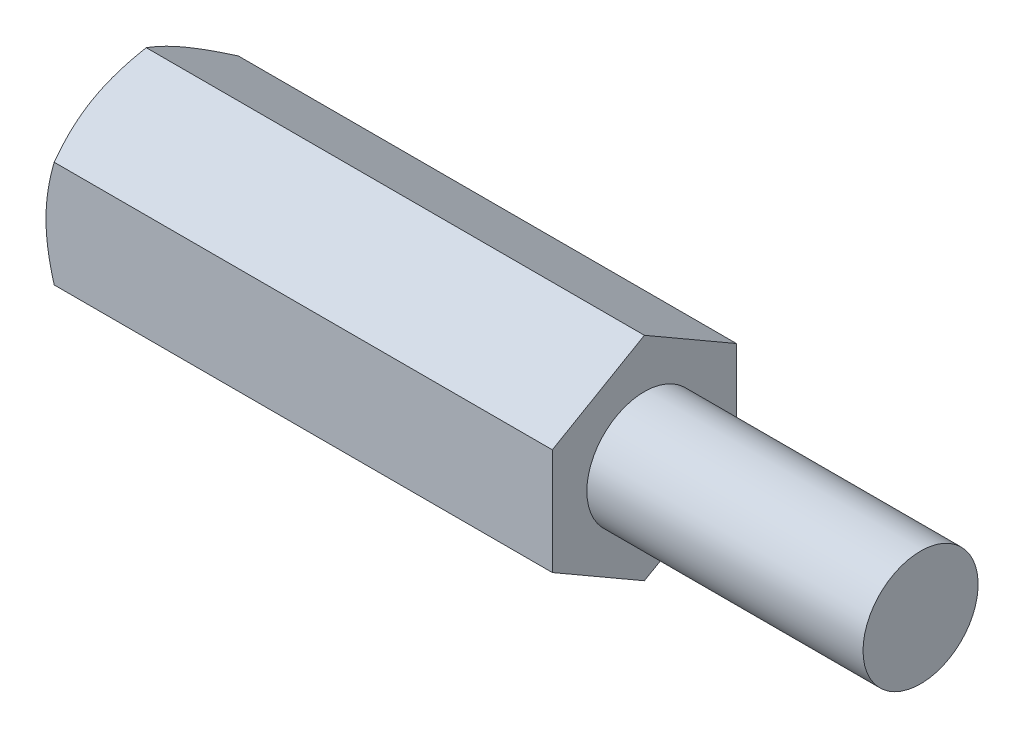
ISO-10303-21;
HEADER;
FILE_DESCRIPTION(('STEP AP214'),'2;1');
FILE_NAME('part.step','',(''),(''),'','','');
FILE_SCHEMA(('AUTOMOTIVE_DESIGN { 1 0 10303 214 1 1 1 1 }'));
ENDSEC;
DATA;
#1=APPLICATION_CONTEXT('core data for automotive mechanical design processes');
#2=APPLICATION_PROTOCOL_DEFINITION('international standard','automotive_design',2000,#1);
#3=PRODUCT_CONTEXT('',#1,'mechanical');
#4=PRODUCT('Part','Part','',(#3));
#5=PRODUCT_RELATED_PRODUCT_CATEGORY('part','',(#4));
#6=PRODUCT_DEFINITION_FORMATION('','',#4);
#7=PRODUCT_DEFINITION_CONTEXT('part definition',#1,'design');
#8=PRODUCT_DEFINITION('design','',#6,#7);
#9=PRODUCT_DEFINITION_SHAPE('','',#8);
#10=(LENGTH_UNIT() NAMED_UNIT(*) SI_UNIT(.MILLI.,.METRE.));
#11=(NAMED_UNIT(*) PLANE_ANGLE_UNIT() SI_UNIT($,.RADIAN.));
#12=(NAMED_UNIT(*) SI_UNIT($,.STERADIAN.) SOLID_ANGLE_UNIT());
#13=UNCERTAINTY_MEASURE_WITH_UNIT(LENGTH_MEASURE(1.E-05),#10,'distance_accuracy_value','');
#14=(GEOMETRIC_REPRESENTATION_CONTEXT(3) GLOBAL_UNCERTAINTY_ASSIGNED_CONTEXT((#13)) GLOBAL_UNIT_ASSIGNED_CONTEXT((#10,
#11,#12)) REPRESENTATION_CONTEXT('',''));
#15=CARTESIAN_POINT('',(0.,0.,0.));
#16=DIRECTION('',(0.,0.,1.));
#17=DIRECTION('',(1.,0.,0.));
#18=AXIS2_PLACEMENT_3D('',#15,#16,#17);
#19=CARTESIAN_POINT('',(11.,1.25,0.));
#20=DIRECTION('',(-1.,0.,0.));
#21=DIRECTION('',(0.,0.,1.));
#22=AXIS2_PLACEMENT_3D('',#19,#20,#21);
#23=PLANE('',#22);
#24=CARTESIAN_POINT('',(11.,0.,0.));
#25=DIRECTION('',(-1.,0.,0.));
#26=DIRECTION('',(0.,0.,1.));
#27=AXIS2_PLACEMENT_3D('',#24,#25,#26);
#28=CIRCLE('',#27,1.25);
#29=CARTESIAN_POINT('',(11.,0.,1.25));
#30=VERTEX_POINT('',#29);
#31=EDGE_CURVE('E198',#30,#30,#28,.T.);
#32=ORIENTED_EDGE('',*,*,#31,.T.);
#33=EDGE_LOOP('',(#32));
#34=FACE_BOUND('',#33,.T.);
#35=DIRECTION('',(0.,1.,0.));
#36=VECTOR('',#35,1.);
#37=CARTESIAN_POINT('',(11.,-1.15470054342504,2.));
#38=LINE('',#37,#36);
#39=CARTESIAN_POINT('',(11.,-1.15470054342504,2.));
#40=VERTEX_POINT('',#39);
#41=CARTESIAN_POINT('',(11.,1.1547005434253,2.));
#42=VERTEX_POINT('',#41);
#43=EDGE_CURVE('E62',#40,#42,#38,.T.);
#44=ORIENTED_EDGE('',*,*,#43,.F.);
#45=DIRECTION('',(0.,0.50000000163871,0.866025402838329));
#46=VECTOR('',#45,1.);
#47=CARTESIAN_POINT('',(11.,-2.30940108685021,0.));
#48=LINE('',#47,#46);
#49=CARTESIAN_POINT('',(11.,-2.30940108685021,0.));
#50=VERTEX_POINT('',#49);
#51=EDGE_CURVE('E135',#50,#40,#48,.T.);
#52=ORIENTED_EDGE('',*,*,#51,.F.);
#53=DIRECTION('',(0.,-0.50000000163871,0.866025402838329));
#54=VECTOR('',#53,1.);
#55=CARTESIAN_POINT('',(11.,-1.15470054342504,-2.));
#56=LINE('',#55,#54);
#57=CARTESIAN_POINT('',(11.,-1.15470054342504,-2.));
#58=VERTEX_POINT('',#57);
#59=EDGE_CURVE('E133',#58,#50,#56,.T.);
#60=ORIENTED_EDGE('',*,*,#59,.F.);
#61=DIRECTION('',(0.,-1.,0.));
#62=VECTOR('',#61,1.);
#63=CARTESIAN_POINT('',(11.,1.1547005434253,-2.));
#64=LINE('',#63,#62);
#65=CARTESIAN_POINT('',(11.,1.1547005434253,-2.));
#66=VERTEX_POINT('',#65);
#67=EDGE_CURVE('E116',#66,#58,#64,.T.);
#68=ORIENTED_EDGE('',*,*,#67,.F.);
#69=DIRECTION('',(0.,-0.50000000163871,-0.866025402838329));
#70=VECTOR('',#69,1.);
#71=CARTESIAN_POINT('',(11.,2.30940108685047,0.));
#72=LINE('',#71,#70);
#73=CARTESIAN_POINT('',(11.,2.30940108685047,0.));
#74=VERTEX_POINT('',#73);
#75=EDGE_CURVE('E125',#74,#66,#72,.T.);
#76=ORIENTED_EDGE('',*,*,#75,.F.);
#77=DIRECTION('',(0.,0.50000000163871,-0.866025402838329));
#78=VECTOR('',#77,1.);
#79=CARTESIAN_POINT('',(11.,1.1547005434253,2.));
#80=LINE('',#79,#78);
#81=EDGE_CURVE('E129',#42,#74,#80,.T.);
#82=ORIENTED_EDGE('',*,*,#81,.F.);
#83=EDGE_LOOP('',(#44,#52,#60,#68,#76,#82));
#84=FACE_BOUND('',#83,.T.);
#85=ADVANCED_FACE('F39',(#34,#84),#23,.F.);
#86=CARTESIAN_POINT('',(-25.4,0.,0.));
#87=DIRECTION('',(-1.,0.,0.));
#88=DIRECTION('',(0.,0.,1.));
#89=AXIS2_PLACEMENT_3D('',#86,#87,#88);
#90=CYLINDRICAL_SURFACE('',#89,1.25);
#91=CARTESIAN_POINT('',(17.,0.,0.));
#92=DIRECTION('',(-1.,0.,0.));
#93=DIRECTION('',(0.,0.,1.));
#94=AXIS2_PLACEMENT_3D('',#91,#92,#93);
#95=CIRCLE('',#94,1.25);
#96=CARTESIAN_POINT('',(17.,0.,1.25));
#97=VERTEX_POINT('',#96);
#98=EDGE_CURVE('E11',#97,#97,#95,.T.);
#99=ORIENTED_EDGE('',*,*,#98,.T.);
#100=EDGE_LOOP('',(#99));
#101=FACE_BOUND('',#100,.T.);
#102=ORIENTED_EDGE('',*,*,#31,.F.);
#103=EDGE_LOOP('',(#102));
#104=FACE_BOUND('',#103,.T.);
#105=ADVANCED_FACE('F41',(#101,#104),#90,.T.);
#106=CARTESIAN_POINT('',(17.,1.25,0.));
#107=DIRECTION('',(1.,0.,0.));
#108=DIRECTION('',(0.,0.,-1.));
#109=AXIS2_PLACEMENT_3D('',#106,#107,#108);
#110=PLANE('',#109);
#111=ORIENTED_EDGE('',*,*,#98,.F.);
#112=EDGE_LOOP('',(#111));
#113=FACE_BOUND('',#112,.T.);
#114=ADVANCED_FACE('F181',(#113),#110,.T.);
#115=CARTESIAN_POINT('',(11.,-1.15470054342504,2.));
#116=DIRECTION('',(0.,0.,1.));
#117=DIRECTION('',(1.,0.,0.));
#118=AXIS2_PLACEMENT_3D('',#115,#116,#117);
#119=PLANE('',#118);
#120=DIRECTION('',(-1.,0.,0.));
#121=VECTOR('',#120,1.);
#122=CARTESIAN_POINT('',(11.,-1.15470054342504,2.));
#123=LINE('',#122,#121);
#124=CARTESIAN_POINT('',(0.178632796410674,-1.15470054342504,2.));
#125=VERTEX_POINT('',#124);
#126=EDGE_CURVE('E142',#40,#125,#123,.T.);
#127=ORIENTED_EDGE('',*,*,#126,.F.);
#128=ORIENTED_EDGE('',*,*,#43,.T.);
#129=DIRECTION('',(-1.,0.,0.));
#130=VECTOR('',#129,1.);
#131=CARTESIAN_POINT('',(11.,1.1547005434253,2.));
#132=LINE('',#131,#130);
#133=CARTESIAN_POINT('',(0.178632796410748,1.1547005434253,2.));
#134=VERTEX_POINT('',#133);
#135=EDGE_CURVE('E141',#42,#134,#132,.T.);
#136=ORIENTED_EDGE('',*,*,#135,.T.);
#137=CARTESIAN_POINT('',(0.957056035252741,-3.06244142455556,2.));
#138=CARTESIAN_POINT('',(0.914620716986071,-2.97463007242844,2.));
#139=CARTESIAN_POINT('',(0.872607239316099,-2.88661110597733,2.));
#140=CARTESIAN_POINT('',(0.78966501912359,-2.71004568725829,2.));
#141=CARTESIAN_POINT('',(0.748736464409601,-2.62149914687074,2.));
#142=CARTESIAN_POINT('',(0.667989531398199,-2.44328800452768,2.));
#143=CARTESIAN_POINT('',(0.628178846473577,-2.35361990409229,2.));
#144=CARTESIAN_POINT('',(0.550267434773993,-2.17354671293263,2.));
#145=CARTESIAN_POINT('',(0.512166618867227,-2.08314166091505,2.));
#146=CARTESIAN_POINT('',(0.437673414546155,-1.90031896061406,2.));
#147=CARTESIAN_POINT('',(0.401308020111925,-1.80789025261849,2.));
#148=CARTESIAN_POINT('',(0.331432929053308,-1.62196168555666,2.));
#149=CARTESIAN_POINT('',(0.29792296109714,-1.52846192922482,2.));
#150=CARTESIAN_POINT('',(0.234647345520521,-1.34040615035142,2.));
#151=CARTESIAN_POINT('',(0.204874108358164,-1.24585270786937,2.));
#152=CARTESIAN_POINT('',(0.150042847133691,-1.05540167492384,2.));
#153=CARTESIAN_POINT('',(0.124983331958846,-0.959504519872101,2.));
#154=CARTESIAN_POINT('',(0.0807963230720376,-0.766300317125104,2.));
#155=CARTESIAN_POINT('',(0.061670408548191,-0.6689929012986,2.));
#156=CARTESIAN_POINT('',(0.0306374492708818,-0.473205602698497,2.));
#157=CARTESIAN_POINT('',(0.0187304108938292,-0.37472571888934,2.));
#158=CARTESIAN_POINT('',(0.0031918604450166,-0.177729045161477,2.));
#159=CARTESIAN_POINT('',(-0.000492042913101886,-0.0792165117129577,2.));
#160=CARTESIAN_POINT('',(0.000599085383031696,0.117729511913766,2.));
#161=CARTESIAN_POINT('',(0.00537192124070532,0.216163015972978,2.));
#162=CARTESIAN_POINT('',(0.0267238464428689,0.454293515054272,2.));
#163=CARTESIAN_POINT('',(0.0474822979110153,0.593616539266757,2.));
#164=CARTESIAN_POINT('',(0.102198487386641,0.869684921992404,2.));
#165=CARTESIAN_POINT('',(0.136171754763621,1.00642704859823,2.));
#166=CARTESIAN_POINT('',(0.194757476710624,1.21108215477687,2.));
#167=CARTESIAN_POINT('',(0.215855617339288,1.28004154135287,2.));
#168=CARTESIAN_POINT('',(0.260140345496834,1.41723671696285,2.));
#169=CARTESIAN_POINT('',(0.283325492562575,1.4854729692969,2.));
#170=CARTESIAN_POINT('',(0.331300908244958,1.62094138259247,2.));
#171=CARTESIAN_POINT('',(0.356081407628868,1.68817703339494,2.));
#172=CARTESIAN_POINT('',(0.407096896301028,1.82212667668353,2.));
#173=CARTESIAN_POINT('',(0.433332473440037,1.88884044572595,2.));
#174=CARTESIAN_POINT('',(0.460152088678855,1.95531251245151,2.));
#175=B_SPLINE_CURVE_WITH_KNOTS('',3,(#137,#138,#139,#140,#141,#142,#143,#144,#145,#146,#147,
#148,#149,#150,#151,#152,#153,#154,#155,#156,#157,#158,#159,#160,#161,#162,#163,#164,#165,#166,
#167,#168,#169,#170,#171,#172,#173,#174),.UNSPECIFIED.,.F.,.F.,(4,2,2,2,2,2,2,2,2,2,2,2,2,2,2,2,
2,2,4),(0.,0.292586066543051,0.585222455540985,0.879533474925353,1.1738291346447,
1.47176863507809,1.76967979269999,2.0669757295403,2.36417746268669,2.6614582263645,
2.95873925262906,3.25412076794973,3.54942559855063,3.97114357120102,4.39335862958824,
4.60967721804901,4.82584763060212,5.04080129319698,5.25584243867033),.UNSPECIFIED.);
#176=CARTESIAN_POINT('',(0.,0.,2.));
#177=VERTEX_POINT('',#176);
#178=EDGE_CURVE('E183',#177,#134,#175,.T.);
#179=ORIENTED_EDGE('',*,*,#178,.F.);
#180=EDGE_CURVE('E190',#125,#177,#175,.T.);
#181=ORIENTED_EDGE('',*,*,#180,.F.);
#182=EDGE_LOOP('',(#127,#128,#136,#179,#181));
#183=FACE_BOUND('',#182,.T.);
#184=ADVANCED_FACE('F177',(#183),#119,.T.);
#185=CARTESIAN_POINT('',(11.,-2.30940108685021,0.));
#186=DIRECTION('',(0.,-0.866025402838329,0.50000000163871));
#187=DIRECTION('',(0.,-0.50000000163871,-0.866025402838329));
#188=AXIS2_PLACEMENT_3D('',#185,#186,#187);
#189=PLANE('',#188);
#190=DIRECTION('',(-1.,0.,0.));
#191=VECTOR('',#190,1.);
#192=CARTESIAN_POINT('',(11.,-2.30940108685021,0.));
#193=LINE('',#192,#191);
#194=CARTESIAN_POINT('',(0.17863280078053,-2.30940108685021,0.));
#195=VERTEX_POINT('',#194);
#196=EDGE_CURVE('E146',#50,#195,#193,.T.);
#197=ORIENTED_EDGE('',*,*,#196,.F.);
#198=ORIENTED_EDGE('',*,*,#51,.T.);
#199=ORIENTED_EDGE('',*,*,#126,.T.);
#200=CARTESIAN_POINT('',(0.178699472447238,-2.30951655690455,-0.000200000000000274));
#201=CARTESIAN_POINT('',(0.149389541713136,-2.25877251223705,0.0876912631615816));
#202=CARTESIAN_POINT('',(0.122732857379663,-2.20759045000358,0.176341194998713));
#203=CARTESIAN_POINT('',(0.0762024960054413,-2.10433998352686,0.355176248060096));
#204=CARTESIAN_POINT('',(0.0563452811664606,-2.05226974414309,0.445364547840949));
#205=CARTESIAN_POINT('',(0.0254334684341431,-1.94877460427243,0.624623387650025));
#206=CARTESIAN_POINT('',(0.014173155837037,-1.89736563131395,0.713666340389943));
#207=CARTESIAN_POINT('',(0.000728666528185515,-1.79430568634968,0.892171400513261));
#208=CARTESIAN_POINT('',(-0.00146664124567084,-1.74265508914632,0.981632858719819));
#209=CARTESIAN_POINT('',(0.0030909929179857,-1.64613627004121,1.14880835656588));
#210=CARTESIAN_POINT('',(0.0087248781379832,-1.60125362778227,1.2265473729966));
#211=CARTESIAN_POINT('',(0.0265838983950965,-1.51178076491365,1.38151891670648));
#212=CARTESIAN_POINT('',(0.0388151389772299,-1.4671908539648,1.45875090763735));
#213=CARTESIAN_POINT('',(0.0693934394282883,-1.37753339115385,1.61404218782503));
#214=CARTESIAN_POINT('',(0.0878701694121921,-1.33247719167835,1.69208181417154));
#215=CARTESIAN_POINT('',(0.129805520119186,-1.24303694428905,1.84699686621438));
#216=CARTESIAN_POINT('',(0.153254282172921,-1.19865174977415,1.92387427788207));
#217=CARTESIAN_POINT('',(0.178699468076727,-1.1545850733707,2.0002));
#218=B_SPLINE_CURVE_WITH_KNOTS('',3,(#200,#201,#202,#203,#204,#205,#206,#207,#208,#209,#210,
#211,#212,#213,#214,#215,#216,#217),.UNSPECIFIED.,.F.,.F.,(4,2,2,2,2,2,2,2,4),(0.,
0.317031826064824,0.63482587909498,0.944753971744867,1.25430138543617,1.52387047764527,
1.79368947260153,2.06949491348278,2.3447585106487),.UNSPECIFIED.);
#219=CARTESIAN_POINT('',(0.,-1.73205081135322,1.00000000655478));
#220=VERTEX_POINT('',#219);
#221=EDGE_CURVE('E192',#220,#125,#218,.T.);
#222=ORIENTED_EDGE('',*,*,#221,.F.);
#223=EDGE_CURVE('E191',#195,#220,#218,.T.);
#224=ORIENTED_EDGE('',*,*,#223,.F.);
#225=EDGE_LOOP('',(#197,#198,#199,#222,#224));
#226=FACE_BOUND('',#225,.T.);
#227=ADVANCED_FACE('F180',(#226),#189,.T.);
#228=CARTESIAN_POINT('',(11.,-1.15470054342504,-2.));
#229=DIRECTION('',(0.,-0.866025402838329,-0.50000000163871));
#230=DIRECTION('',(0.,0.50000000163871,-0.866025402838329));
#231=AXIS2_PLACEMENT_3D('',#228,#229,#230);
#232=PLANE('',#231);
#233=DIRECTION('',(-1.,0.,0.));
#234=VECTOR('',#233,1.);
#235=CARTESIAN_POINT('',(11.,-1.15470054342504,-2.));
#236=LINE('',#235,#234);
#237=CARTESIAN_POINT('',(0.178632796410674,-1.15470054342504,-2.));
#238=VERTEX_POINT('',#237);
#239=EDGE_CURVE('E122',#58,#238,#236,.T.);
#240=ORIENTED_EDGE('',*,*,#239,.F.);
#241=ORIENTED_EDGE('',*,*,#59,.T.);
#242=ORIENTED_EDGE('',*,*,#196,.T.);
#243=CARTESIAN_POINT('',(0.178699468076727,-1.1545850733707,-2.0002));
#244=CARTESIAN_POINT('',(0.149389537698732,-1.20532911791537,-1.91230873705116));
#245=CARTESIAN_POINT('',(0.122732853744153,-1.25651118002525,-1.82365880542809));
#246=CARTESIAN_POINT('',(0.0762024931576847,-1.35976164624295,-1.64482375281536));
#247=CARTESIAN_POINT('',(0.0563452787271526,-1.4118318854912,-1.55463545326923));
#248=CARTESIAN_POINT('',(0.025433466807708,-1.51532702508575,-1.37537661393839));
#249=CARTESIAN_POINT('',(0.0141731546157665,-1.56673599790406,-1.28633366144125));
#250=CARTESIAN_POINT('',(0.000728666088107046,-1.66979594257144,-1.10782860183216));
#251=CARTESIAN_POINT('',(-0.0014666413094746,-1.7214465396181,-1.01836714389701));
#252=CARTESIAN_POINT('',(0.0030909935091759,-1.81796535871707,-0.851191646061586));
#253=CARTESIAN_POINT('',(0.00872487906311662,-1.86284800112778,-0.773452629368013));
#254=CARTESIAN_POINT('',(0.0265839000050529,-1.95232086428772,-0.618481085153548));
#255=CARTESIAN_POINT('',(0.0388151409381359,-1.99691077537611,-0.54124909398096));
#256=CARTESIAN_POINT('',(0.0693934420943215,-2.08656823846334,-0.385957813314767));
#257=CARTESIAN_POINT('',(0.0878701724327647,-2.1316244380753,-0.307918186731899));
#258=CARTESIAN_POINT('',(0.129805523830887,-2.22106468572975,-0.15300313422982));
#259=CARTESIAN_POINT('',(0.153254286221072,-2.26544988037335,-0.0761257223392072));
#260=CARTESIAN_POINT('',(0.178699472447238,-2.30951655690455,0.00019999999999971));
#261=B_SPLINE_CURVE_WITH_KNOTS('',3,(#243,#244,#245,#246,#247,#248,#249,#250,#251,#252,#253,
#254,#255,#256,#257,#258,#259,#260),.UNSPECIFIED.,.F.,.F.,(4,2,2,2,2,2,2,2,4),(0.,
0.31703182505886,0.634825877058606,0.944753968739785,1.25430138147083,1.52387047464978,
1.79368947057901,2.06949491247725,2.34475851064868),.UNSPECIFIED.);
#262=CARTESIAN_POINT('',(0.,-1.73205081135322,-1.00000000655478));
#263=VERTEX_POINT('',#262);
#264=EDGE_CURVE('E221',#263,#195,#261,.T.);
#265=ORIENTED_EDGE('',*,*,#264,.F.);
#266=EDGE_CURVE('E226',#238,#263,#261,.T.);
#267=ORIENTED_EDGE('',*,*,#266,.F.);
#268=EDGE_LOOP('',(#240,#241,#242,#265,#267));
#269=FACE_BOUND('',#268,.T.);
#270=ADVANCED_FACE('F282',(#269),#232,.T.);
#271=CARTESIAN_POINT('',(11.,1.1547005434253,-2.));
#272=DIRECTION('',(0.,0.,-1.));
#273=DIRECTION('',(-1.,0.,0.));
#274=AXIS2_PLACEMENT_3D('',#271,#272,#273);
#275=PLANE('',#274);
#276=DIRECTION('',(-1.,0.,0.));
#277=VECTOR('',#276,1.);
#278=CARTESIAN_POINT('',(11.,1.1547005434253,-2.));
#279=LINE('',#278,#277);
#280=CARTESIAN_POINT('',(0.178632796410748,1.1547005434253,-2.));
#281=VERTEX_POINT('',#280);
#282=EDGE_CURVE('E111',#66,#281,#279,.T.);
#283=ORIENTED_EDGE('',*,*,#282,.F.);
#284=ORIENTED_EDGE('',*,*,#67,.T.);
#285=ORIENTED_EDGE('',*,*,#239,.T.);
#286=CARTESIAN_POINT('',(0.957056035252741,-3.06244142455556,-2.));
#287=CARTESIAN_POINT('',(0.914620716986071,-2.97463007242844,-2.));
#288=CARTESIAN_POINT('',(0.872607239316099,-2.88661110597733,-2.));
#289=CARTESIAN_POINT('',(0.78966501912359,-2.71004568725829,-2.));
#290=CARTESIAN_POINT('',(0.748736464409601,-2.62149914687074,-2.));
#291=CARTESIAN_POINT('',(0.667989531398199,-2.44328800452768,-2.));
#292=CARTESIAN_POINT('',(0.628178846473577,-2.35361990409229,-2.));
#293=CARTESIAN_POINT('',(0.550267434773993,-2.17354671293263,-2.));
#294=CARTESIAN_POINT('',(0.512166618867227,-2.08314166091505,-2.));
#295=CARTESIAN_POINT('',(0.437673414546155,-1.90031896061406,-2.));
#296=CARTESIAN_POINT('',(0.401308020111925,-1.80789025261849,-2.));
#297=CARTESIAN_POINT('',(0.331432929053308,-1.62196168555666,-2.));
#298=CARTESIAN_POINT('',(0.29792296109714,-1.52846192922482,-2.));
#299=CARTESIAN_POINT('',(0.234647345520521,-1.34040615035142,-2.));
#300=CARTESIAN_POINT('',(0.204874108358164,-1.24585270786937,-2.));
#301=CARTESIAN_POINT('',(0.150042847133691,-1.05540167492384,-2.));
#302=CARTESIAN_POINT('',(0.124983331958846,-0.959504519872101,-2.));
#303=CARTESIAN_POINT('',(0.0807963230720376,-0.766300317125104,-2.));
#304=CARTESIAN_POINT('',(0.061670408548191,-0.6689929012986,-2.));
#305=CARTESIAN_POINT('',(0.0306374492708818,-0.473205602698497,-2.));
#306=CARTESIAN_POINT('',(0.0187304108938292,-0.37472571888934,-2.));
#307=CARTESIAN_POINT('',(0.0031918604450166,-0.177729045161477,-2.));
#308=CARTESIAN_POINT('',(-0.000492042913101886,-0.0792165117129577,-2.));
#309=CARTESIAN_POINT('',(0.000599085383031696,0.117729511913766,-2.));
#310=CARTESIAN_POINT('',(0.00537192124070532,0.216163015972978,-2.));
#311=CARTESIAN_POINT('',(0.0267238464428689,0.454293515054272,-2.));
#312=CARTESIAN_POINT('',(0.0474822979110153,0.593616539266757,-2.));
#313=CARTESIAN_POINT('',(0.102198487386641,0.869684921992404,-2.));
#314=CARTESIAN_POINT('',(0.136171754763621,1.00642704859823,-2.));
#315=CARTESIAN_POINT('',(0.194757476710624,1.21108215477687,-2.));
#316=CARTESIAN_POINT('',(0.215855617339288,1.28004154135287,-2.));
#317=CARTESIAN_POINT('',(0.260140345496834,1.41723671696285,-2.));
#318=CARTESIAN_POINT('',(0.283325492562575,1.4854729692969,-2.));
#319=CARTESIAN_POINT('',(0.331300908244958,1.62094138259247,-2.));
#320=CARTESIAN_POINT('',(0.356081407628868,1.68817703339494,-2.));
#321=CARTESIAN_POINT('',(0.407096896301028,1.82212667668353,-2.));
#322=CARTESIAN_POINT('',(0.433332473440037,1.88884044572595,-2.));
#323=CARTESIAN_POINT('',(0.460152088678855,1.95531251245151,-2.));
#324=B_SPLINE_CURVE_WITH_KNOTS('',3,(#286,#287,#288,#289,#290,#291,#292,#293,#294,#295,#296,
#297,#298,#299,#300,#301,#302,#303,#304,#305,#306,#307,#308,#309,#310,#311,#312,#313,#314,#315,
#316,#317,#318,#319,#320,#321,#322,#323),.UNSPECIFIED.,.F.,.F.,(4,2,2,2,2,2,2,2,2,2,2,2,2,2,2,2,
2,2,4),(0.,0.292586066543051,0.585222455540985,0.879533474925353,1.1738291346447,
1.47176863507809,1.76967979269999,2.0669757295403,2.36417746268669,2.6614582263645,
2.95873925262906,3.25412076794973,3.54942559855063,3.97114357120102,4.39335862958824,
4.60967721804901,4.82584763060212,5.04080129319698,5.25584243867033),.UNSPECIFIED.);
#325=CARTESIAN_POINT('',(0.,0.,-2.));
#326=VERTEX_POINT('',#325);
#327=EDGE_CURVE('E222',#326,#238,#324,.F.);
#328=ORIENTED_EDGE('',*,*,#327,.F.);
#329=EDGE_CURVE('E119',#281,#326,#324,.F.);
#330=ORIENTED_EDGE('',*,*,#329,.F.);
#331=EDGE_LOOP('',(#283,#284,#285,#328,#330));
#332=FACE_BOUND('',#331,.T.);
#333=ADVANCED_FACE('F113',(#332),#275,.T.);
#334=CARTESIAN_POINT('',(11.,2.30940108685047,0.));
#335=DIRECTION('',(0.,0.866025402838329,-0.50000000163871));
#336=DIRECTION('',(0.,0.50000000163871,0.866025402838329));
#337=AXIS2_PLACEMENT_3D('',#334,#335,#336);
#338=PLANE('',#337);
#339=DIRECTION('',(-1.,0.,0.));
#340=VECTOR('',#339,1.);
#341=CARTESIAN_POINT('',(11.,2.30940108685047,0.));
#342=LINE('',#341,#340);
#343=CARTESIAN_POINT('',(0.178632800780678,2.30940108685047,0.));
#344=VERTEX_POINT('',#343);
#345=EDGE_CURVE('E54',#74,#344,#342,.T.);
#346=ORIENTED_EDGE('',*,*,#345,.F.);
#347=ORIENTED_EDGE('',*,*,#75,.T.);
#348=ORIENTED_EDGE('',*,*,#282,.T.);
#349=CARTESIAN_POINT('',(0.178699472447386,2.30951655690481,0.000199999999999615));
#350=CARTESIAN_POINT('',(0.149389541713281,2.2587725122373,-0.0876912631615918));
#351=CARTESIAN_POINT('',(0.122732857379804,2.20759045000383,-0.176341194998732));
#352=CARTESIAN_POINT('',(0.0762024960055777,2.10433998352709,-0.355176248060135));
#353=CARTESIAN_POINT('',(0.056345281166595,2.05226974414331,-0.445364547840998));
#354=CARTESIAN_POINT('',(0.025433468434274,1.94877460427265,-0.624623387650094));
#355=CARTESIAN_POINT('',(0.0141731558371666,1.89736563131416,-0.713666340390022));
#356=CARTESIAN_POINT('',(0.000728666528313517,1.79430568634988,-0.89217140051336));
#357=CARTESIAN_POINT('',(-0.00146664124554322,1.74265508914652,-0.981632858719928));
#358=CARTESIAN_POINT('',(0.00309099291811341,1.6461362700414,-1.14880835656599));
#359=CARTESIAN_POINT('',(0.00872487813810952,1.60125362778246,-1.2265473729967));
#360=CARTESIAN_POINT('',(0.0265838983952174,1.51178076491386,-1.38151891670656));
#361=CARTESIAN_POINT('',(0.0388151389773468,1.46719085396502,-1.45875090763742));
#362=CARTESIAN_POINT('',(0.0693934394283953,1.37753339115408,-1.61404218782508));
#363=CARTESIAN_POINT('',(0.0878701694122932,1.33247719167859,-1.69208181417157));
#364=CARTESIAN_POINT('',(0.129805520119274,1.24303694428929,-1.8469968662144));
#365=CARTESIAN_POINT('',(0.153254282173002,1.1986517497744,-1.92387427788208));
#366=CARTESIAN_POINT('',(0.178699468076801,1.15458507337096,-2.0002));
#367=B_SPLINE_CURVE_WITH_KNOTS('',3,(#349,#350,#351,#352,#353,#354,#355,#356,#357,#358,#359,
#360,#361,#362,#363,#364,#365,#366),.UNSPECIFIED.,.F.,.F.,(4,2,2,2,2,2,2,2,4),(0.,
0.317031826064858,0.63482587909505,0.944753971744971,1.25430138543631,1.52387047764537,
1.79368947260159,2.06949491348281,2.34475851064869),.UNSPECIFIED.);
#368=CARTESIAN_POINT('',(0.,1.73205081135341,-1.0000000065549));
#369=VERTEX_POINT('',#368);
#370=EDGE_CURVE('E160',#369,#281,#367,.T.);
#371=ORIENTED_EDGE('',*,*,#370,.F.);
#372=EDGE_CURVE('E382',#344,#369,#367,.T.);
#373=ORIENTED_EDGE('',*,*,#372,.F.);
#374=EDGE_LOOP('',(#346,#347,#348,#371,#373));
#375=FACE_BOUND('',#374,.T.);
#376=ADVANCED_FACE('F126',(#375),#338,.T.);
#377=CARTESIAN_POINT('',(11.,1.1547005434253,2.));
#378=DIRECTION('',(0.,0.866025402838329,0.50000000163871));
#379=DIRECTION('',(0.,-0.50000000163871,0.866025402838329));
#380=AXIS2_PLACEMENT_3D('',#377,#378,#379);
#381=PLANE('',#380);
#382=ORIENTED_EDGE('',*,*,#135,.F.);
#383=ORIENTED_EDGE('',*,*,#81,.T.);
#384=ORIENTED_EDGE('',*,*,#345,.T.);
#385=CARTESIAN_POINT('',(0.178699468076801,1.15458507337095,2.0002));
#386=CARTESIAN_POINT('',(0.149389537698809,1.20532911791563,1.91230873705116));
#387=CARTESIAN_POINT('',(0.122732853744234,1.25651118002552,1.82365880542808));
#388=CARTESIAN_POINT('',(0.076202493157773,1.35976164624322,1.64482375281534));
#389=CARTESIAN_POINT('',(0.0563452787272454,1.41183188549148,1.5546354532692));
#390=CARTESIAN_POINT('',(0.025433466807811,1.51532702508603,1.37537661393835));
#391=CARTESIAN_POINT('',(0.0141731546158751,1.56673599790435,1.2863336614412));
#392=CARTESIAN_POINT('',(0.000728666088227406,1.66979594257173,1.1078286018321));
#393=CARTESIAN_POINT('',(-0.00146664130934813,1.72144653961839,1.01836714389695));
#394=CARTESIAN_POINT('',(0.00309099350931342,1.81796535871737,0.851191646061521));
#395=CARTESIAN_POINT('',(0.00872487906325818,1.86284800112807,0.773452629367954));
#396=CARTESIAN_POINT('',(0.0265839000052006,1.952320864288,0.618481085153501));
#397=CARTESIAN_POINT('',(0.0388151409382858,1.99691077537639,0.541249093980918));
#398=CARTESIAN_POINT('',(0.0693934420944735,2.08656823846361,0.385957813314737));
#399=CARTESIAN_POINT('',(0.0878701724329167,2.13162443807557,0.307918186731876));
#400=CARTESIAN_POINT('',(0.129805523831038,2.22106468573001,0.153003134229808));
#401=CARTESIAN_POINT('',(0.153254286221221,2.26544988037361,0.076125722339201));
#402=CARTESIAN_POINT('',(0.178699472447386,2.30951655690481,-0.000200000000000336));
#403=B_SPLINE_CURVE_WITH_KNOTS('',3,(#385,#386,#387,#388,#389,#390,#391,#392,#393,#394,#395,
#396,#397,#398,#399,#400,#401,#402),.UNSPECIFIED.,.F.,.F.,(4,2,2,2,2,2,2,2,4),(0.,
0.317031825058877,0.634825877058642,0.944753968739839,1.2543013814709,1.52387047464983,
1.79368947057905,2.06949491247727,2.34475851064868),.UNSPECIFIED.);
#404=CARTESIAN_POINT('',(0.,1.73205081135341,1.00000000655489));
#405=VERTEX_POINT('',#404);
#406=EDGE_CURVE('E145',#405,#344,#403,.T.);
#407=ORIENTED_EDGE('',*,*,#406,.F.);
#408=EDGE_CURVE('E159',#134,#405,#403,.T.);
#409=ORIENTED_EDGE('',*,*,#408,.F.);
#410=EDGE_LOOP('',(#382,#383,#384,#407,#409));
#411=FACE_BOUND('',#410,.T.);
#412=ADVANCED_FACE('F170',(#411),#381,.T.);
#413=CARTESIAN_POINT('',(0.,0.,0.));
#414=DIRECTION('',(1.,0.,0.));
#415=DIRECTION('',(0.,0.,-1.));
#416=AXIS2_PLACEMENT_3D('',#413,#414,#415);
#417=CONICAL_SURFACE('',#416,2.,1.0471975511966);
#418=CARTESIAN_POINT('',(0.,0.,0.));
#419=DIRECTION('',(-1.,0.,0.));
#420=DIRECTION('',(0.,0.,1.));
#421=AXIS2_PLACEMENT_3D('',#418,#419,#420);
#422=CIRCLE('',#421,2.);
#423=EDGE_CURVE('E200',#220,#177,#422,.T.);
#424=ORIENTED_EDGE('',*,*,#423,.F.);
#425=ORIENTED_EDGE('',*,*,#221,.T.);
#426=ORIENTED_EDGE('',*,*,#180,.T.);
#427=EDGE_LOOP('',(#424,#425,#426));
#428=FACE_BOUND('',#427,.T.);
#429=ADVANCED_FACE('F174',(#428),#417,.T.);
#430=EDGE_CURVE('E208',#263,#220,#422,.T.);
#431=ORIENTED_EDGE('',*,*,#430,.F.);
#432=ORIENTED_EDGE('',*,*,#264,.T.);
#433=ORIENTED_EDGE('',*,*,#223,.T.);
#434=EDGE_LOOP('',(#431,#432,#433));
#435=FACE_BOUND('',#434,.T.);
#436=ADVANCED_FACE('F231',(#435),#417,.T.);
#437=ORIENTED_EDGE('',*,*,#327,.T.);
#438=ORIENTED_EDGE('',*,*,#266,.T.);
#439=EDGE_CURVE('E211',#326,#263,#422,.T.);
#440=ORIENTED_EDGE('',*,*,#439,.F.);
#441=EDGE_LOOP('',(#437,#438,#440));
#442=FACE_BOUND('',#441,.T.);
#443=ADVANCED_FACE('F166',(#442),#417,.T.);
#444=ORIENTED_EDGE('',*,*,#370,.T.);
#445=ORIENTED_EDGE('',*,*,#329,.T.);
#446=EDGE_CURVE('E207',#369,#326,#422,.T.);
#447=ORIENTED_EDGE('',*,*,#446,.F.);
#448=EDGE_LOOP('',(#444,#445,#447));
#449=FACE_BOUND('',#448,.T.);
#450=ADVANCED_FACE('F220',(#449),#417,.T.);
#451=EDGE_CURVE('E47',#177,#405,#422,.T.);
#452=ORIENTED_EDGE('',*,*,#451,.F.);
#453=ORIENTED_EDGE('',*,*,#178,.T.);
#454=ORIENTED_EDGE('',*,*,#408,.T.);
#455=EDGE_LOOP('',(#452,#453,#454));
#456=FACE_BOUND('',#455,.T.);
#457=ADVANCED_FACE('F249',(#456),#417,.T.);
#458=CARTESIAN_POINT('',(0.,0.,0.));
#459=DIRECTION('',(-1.,0.,0.));
#460=DIRECTION('',(0.,0.,1.));
#461=AXIS2_PLACEMENT_3D('',#458,#459,#460);
#462=PLANE('',#461);
#463=CARTESIAN_POINT('',(0.,0.,0.));
#464=DIRECTION('',(-1.,0.,0.));
#465=DIRECTION('',(0.,0.,1.));
#466=AXIS2_PLACEMENT_3D('',#463,#464,#465);
#467=CIRCLE('',#466,1.00391309713108);
#468=CARTESIAN_POINT('',(0.,0.,1.00391309713108));
#469=VERTEX_POINT('',#468);
#470=EDGE_CURVE('E239',#469,#469,#467,.T.);
#471=ORIENTED_EDGE('',*,*,#470,.F.);
#472=EDGE_LOOP('',(#471));
#473=FACE_BOUND('',#472,.T.);
#474=ORIENTED_EDGE('',*,*,#451,.T.);
#475=EDGE_CURVE('E202',#405,#369,#422,.T.);
#476=ORIENTED_EDGE('',*,*,#475,.T.);
#477=ORIENTED_EDGE('',*,*,#446,.T.);
#478=ORIENTED_EDGE('',*,*,#439,.T.);
#479=ORIENTED_EDGE('',*,*,#430,.T.);
#480=ORIENTED_EDGE('',*,*,#423,.T.);
#481=EDGE_LOOP('',(#474,#476,#477,#478,#479,#480));
#482=FACE_BOUND('',#481,.T.);
#483=ADVANCED_FACE('F217',(#473,#482),#462,.T.);
#484=ORIENTED_EDGE('',*,*,#406,.T.);
#485=ORIENTED_EDGE('',*,*,#372,.T.);
#486=ORIENTED_EDGE('',*,*,#475,.F.);
#487=EDGE_LOOP('',(#484,#485,#486));
#488=FACE_BOUND('',#487,.T.);
#489=ADVANCED_FACE('F248',(#488),#417,.T.);
#490=CARTESIAN_POINT('',(6.,0.,0.));
#491=DIRECTION('',(-1.,0.,0.));
#492=DIRECTION('',(0.,0.,1.));
#493=AXIS2_PLACEMENT_3D('',#490,#491,#492);
#494=CYLINDRICAL_SURFACE('',#493,1.00391309713108);
#495=CARTESIAN_POINT('',(6.,0.,0.));
#496=DIRECTION('',(-1.,0.,0.));
#497=DIRECTION('',(0.,0.,1.));
#498=AXIS2_PLACEMENT_3D('',#495,#496,#497);
#499=CIRCLE('',#498,1.00391309713108);
#500=CARTESIAN_POINT('',(6.,0.,1.00391309713108));
#501=VERTEX_POINT('',#500);
#502=EDGE_CURVE('E236',#501,#501,#499,.T.);
#503=ORIENTED_EDGE('',*,*,#502,.F.);
#504=EDGE_LOOP('',(#503));
#505=FACE_BOUND('',#504,.T.);
#506=ORIENTED_EDGE('',*,*,#470,.T.);
#507=EDGE_LOOP('',(#506));
#508=FACE_BOUND('',#507,.T.);
#509=ADVANCED_FACE('F245',(#505,#508),#494,.F.);
#510=CARTESIAN_POINT('',(6.,0.,0.));
#511=DIRECTION('',(-1.,0.,0.));
#512=DIRECTION('',(0.,0.,1.));
#513=AXIS2_PLACEMENT_3D('',#510,#511,#512);
#514=PLANE('',#513);
#515=ORIENTED_EDGE('',*,*,#502,.T.);
#516=EDGE_LOOP('',(#515));
#517=FACE_BOUND('',#516,.T.);
#518=ADVANCED_FACE('F347',(#517),#514,.T.);
#519=CLOSED_SHELL('',(#85,#105,#114,#184,#227,#270,#333,#376,#412,#429,#436,#443,#450,#457,#483,
#489,#509,#518));
#520=MANIFOLD_SOLID_BREP('B2',#519);
#521=ADVANCED_BREP_SHAPE_REPRESENTATION('',(#18,#520),#14);
#522=SHAPE_DEFINITION_REPRESENTATION(#9,#521);
ENDSEC;
END-ISO-10303-21;
